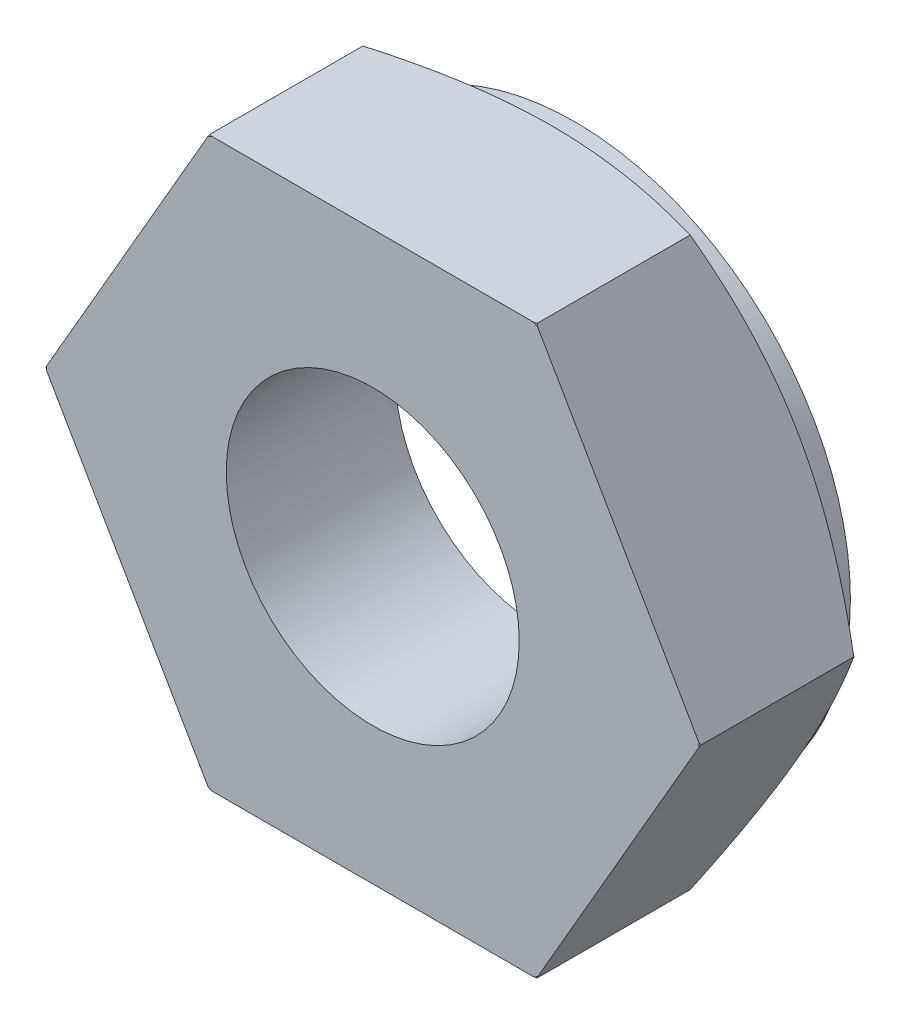
ISO-10303-21;
HEADER;
FILE_DESCRIPTION(('STEP AP214'),'2;1');
FILE_NAME('part.step','',(''),(''),'','','');
FILE_SCHEMA(('AUTOMOTIVE_DESIGN { 1 0 10303 214 1 1 1 1 }'));
ENDSEC;
DATA;
#1=APPLICATION_CONTEXT('core data for automotive mechanical design processes');
#2=APPLICATION_PROTOCOL_DEFINITION('international standard','automotive_design',2000,#1);
#3=PRODUCT_CONTEXT('',#1,'mechanical');
#4=PRODUCT('Part','Part','',(#3));
#5=PRODUCT_RELATED_PRODUCT_CATEGORY('part','',(#4));
#6=PRODUCT_DEFINITION_FORMATION('','',#4);
#7=PRODUCT_DEFINITION_CONTEXT('part definition',#1,'design');
#8=PRODUCT_DEFINITION('design','',#6,#7);
#9=PRODUCT_DEFINITION_SHAPE('','',#8);
#10=(LENGTH_UNIT() NAMED_UNIT(*) SI_UNIT(.MILLI.,.METRE.));
#11=(NAMED_UNIT(*) PLANE_ANGLE_UNIT() SI_UNIT($,.RADIAN.));
#12=(NAMED_UNIT(*) SI_UNIT($,.STERADIAN.) SOLID_ANGLE_UNIT());
#13=UNCERTAINTY_MEASURE_WITH_UNIT(LENGTH_MEASURE(1.E-05),#10,'distance_accuracy_value','');
#14=(GEOMETRIC_REPRESENTATION_CONTEXT(3) GLOBAL_UNCERTAINTY_ASSIGNED_CONTEXT((#13)) GLOBAL_UNIT_ASSIGNED_CONTEXT((#10,
#11,#12)) REPRESENTATION_CONTEXT('',''));
#15=CARTESIAN_POINT('',(0.,0.,0.));
#16=DIRECTION('',(0.,0.,1.));
#17=DIRECTION('',(1.,0.,0.));
#18=AXIS2_PLACEMENT_3D('',#15,#16,#17);
#19=CARTESIAN_POINT('',(-2.6816006012953E-11,-4.74646363879394E-11,-0.680581742286772));
#20=DIRECTION('',(-1.21764595771653E-12,-2.10902466439644E-12,-1.));
#21=DIRECTION('',(0.,1.,-2.10902466439644E-12));
#22=AXIS2_PLACEMENT_3D('',#19,#20,#21);
#23=CONICAL_SURFACE('',#22,4.61880215640778,1.04719755119857);
#24=CARTESIAN_POINT('',(2.30940107875971,3.99999999902235,-0.680581740749376));
#25=CARTESIAN_POINT('',(2.31109554353423,3.99706509745271,-0.679603439812127));
#26=CARTESIAN_POINT('',(2.31279022452801,3.9941298238691,-0.67862663034165));
#27=CARTESIAN_POINT('',(2.31448512075489,3.99119417749059,-0.677651318233623));
#28=CARTESIAN_POINT('',(2.31618001698312,3.98825853110974,-0.676676006124824));
#29=CARTESIAN_POINT('',(2.31787512877524,3.98532251136127,-0.675702191188233));
#30=CARTESIAN_POINT('',(2.31957045600892,3.98238611845708,-0.674729880080408));
#31=CARTESIAN_POINT('',(2.32232641612284,3.97761265551613,-0.673149270403256));
#32=CARTESIAN_POINT('',(2.32508294673428,3.97283820444429,-0.671572634140082));
#33=CARTESIAN_POINT('',(2.32784004726795,3.96806276623838,-0.670000000000012));
#34=B_SPLINE_CURVE_WITH_KNOTS('',3,(#24,#25,#26,#27,#28,#29,#30,#31,#32,#33),.UNSPECIFIED.,.F.,
.F.,(4,3,3,4),(5.99577445606557E-13,1.05819345721559E-05,2.11638691582679E-05,
3.8366090546807E-05),.UNSPECIFIED.);
#35=CARTESIAN_POINT('',(2.30940107875971,3.99999999902235,-0.680581740749376));
#36=VERTEX_POINT('',#35);
#37=CARTESIAN_POINT('',(2.32784004726795,3.96806276623838,-0.670000000000012));
#38=VERTEX_POINT('',#37);
#39=EDGE_CURVE('E188',#36,#38,#34,.T.);
#40=ORIENTED_EDGE('',*,*,#39,.F.);
#41=CARTESIAN_POINT('',(2.27252313573961,4.,-0.670000000000011));
#42=CARTESIAN_POINT('',(2.27591519326911,4.,-0.670967404962364));
#43=CARTESIAN_POINT('',(2.27930681926403,4.00000000000012,-0.671936324305918));
#44=CARTESIAN_POINT('',(2.28269801345091,4.00000000000012,-0.672906751341546));
#45=CARTESIAN_POINT('',(2.28608920763507,4.00000000000012,-0.673877178376397));
#46=CARTESIAN_POINT('',(2.2894799706816,4.00000000000012,-0.674849113295178));
#47=CARTESIAN_POINT('',(2.29287030233476,4.00000000000012,-0.675822549428773));
#48=CARTESIAN_POINT('',(2.2983816994902,4.00000000000012,-0.67740498846027));
#49=CARTESIAN_POINT('',(2.30389195892164,4.00000000000084,-0.678991395326178));
#50=CARTESIAN_POINT('',(2.30940107875971,3.99999999902235,-0.680581740749376));
#51=B_SPLINE_CURVE_WITH_KNOTS('',3,(#41,#42,#43,#44,#45,#46,#47,#48,#49,#50),.UNSPECIFIED.,.F.,
.F.,(4,3,3,4),(0.,1.05819345963508E-05,2.11638691785809E-05,3.83660947732435E-05),.UNSPECIFIED.);
#52=CARTESIAN_POINT('',(2.27252313573961,4.,-0.670000000000011));
#53=VERTEX_POINT('',#52);
#54=EDGE_CURVE('E178',#53,#36,#51,.T.);
#55=ORIENTED_EDGE('',*,*,#54,.F.);
#56=CARTESIAN_POINT('',(6.78146774846233E-12,1.10818472454088E-11,-0.670000000002261));
#57=DIRECTION('',(-2.29799528668942E-13,-4.3197236404671E-13,1.));
#58=DIRECTION('',(0.506000039667893,0.862533454340231,4.88877660549044E-13));
#59=AXIS2_PLACEMENT_3D('',#56,#57,#58);
#60=CIRCLE('',#59,4.60047404104754);
#61=EDGE_CURVE('E144',#38,#53,#60,.T.);
#62=ORIENTED_EDGE('',*,*,#61,.F.);
#63=EDGE_LOOP('',(#40,#55,#62));
#64=FACE_BOUND('',#63,.T.);
#65=ADVANCED_FACE('F17',(#64),#23,.T.);
#66=CARTESIAN_POINT('',(6.49675625796764E-12,-1.04811992418519E-11,-0.680581742289507));
#67=DIRECTION('',(9.74116766164277E-13,-1.68721973150091E-12,-1.));
#68=DIRECTION('',(0.,1.,-1.68721973150091E-12));
#69=AXIS2_PLACEMENT_3D('',#66,#67,#68);
#70=CONICAL_SURFACE('',#69,4.61880215636643,1.04719755119799);
#71=CARTESIAN_POINT('',(-2.30940107491067,4.00000000124463,-0.6805817407494));
#72=CARTESIAN_POINT('',(-2.30601214320622,4.,-0.679603439811884));
#73=CARTESIAN_POINT('',(-2.30262278121873,4.00000000000012,-0.678626630341363));
#74=CARTESIAN_POINT('',(-2.29923298876479,4.00000000000012,-0.677651318233292));
#75=CARTESIAN_POINT('',(-2.29584319630818,4.00000000000012,-0.676676006124449));
#76=CARTESIAN_POINT('',(-2.29245297272378,4.00000000000012,-0.675702191187815));
#77=CARTESIAN_POINT('',(-2.28906231825627,4.00000000000012,-0.674729880079946));
#78=CARTESIAN_POINT('',(-2.28355039802894,4.00000000000012,-0.673149270402948));
#79=CARTESIAN_POINT('',(-2.27803733680642,4.,-0.671572634139929));
#80=CARTESIAN_POINT('',(-2.2725231357396,4.,-0.670000000000011));
#81=B_SPLINE_CURVE_WITH_KNOTS('',3,(#71,#72,#73,#74,#75,#76,#77,#78,#79,#80),.UNSPECIFIED.,.F.,
.F.,(4,3,3,4),(5.99757053684347E-13,1.05819345726432E-05,2.11638691592435E-05,
3.83660905461181E-05),.UNSPECIFIED.);
#82=CARTESIAN_POINT('',(-2.30940107491067,4.00000000124463,-0.6805817407494));
#83=VERTEX_POINT('',#82);
#84=CARTESIAN_POINT('',(-2.2725231357396,4.,-0.670000000000011));
#85=VERTEX_POINT('',#84);
#86=EDGE_CURVE('E105',#83,#85,#81,.T.);
#87=ORIENTED_EDGE('',*,*,#86,.F.);
#88=CARTESIAN_POINT('',(-2.32784004726795,3.96806276623838,-0.670000000000011));
#89=CARTESIAN_POINT('',(-2.32614401850312,3.97100037423016,-0.67096740496241));
#90=CARTESIAN_POINT('',(-2.32444820550568,3.9739376085021,-0.671936324306007));
#91=CARTESIAN_POINT('',(-2.32275260841217,3.97687446881724,-0.672906751341681));
#92=CARTESIAN_POINT('',(-2.32105701132001,3.97981132913003,-0.673877178376577));
#93=CARTESIAN_POINT('',(-2.31936162979667,3.98274781606667,-0.674849113295404));
#94=CARTESIAN_POINT('',(-2.31766646397,3.9856839294057,-0.675822549429045));
#95=CARTESIAN_POINT('',(-2.3149107653923,3.99045693935262,-0.677404988460534));
#96=CARTESIAN_POINT('',(-2.31215563567721,3.99522896400202,-0.678991395326433));
#97=CARTESIAN_POINT('',(-2.30940107491067,4.00000000124463,-0.6805817407494));
#98=B_SPLINE_CURVE_WITH_KNOTS('',3,(#88,#89,#90,#91,#92,#93,#94,#95,#96,#97),.UNSPECIFIED.,.F.,
.F.,(4,3,3,4),(0.,1.05819345968407E-05,2.11638691795613E-05,3.83660947738123E-05),.UNSPECIFIED.);
#99=CARTESIAN_POINT('',(-2.32784004726795,3.96806276623838,-0.670000000000011));
#100=VERTEX_POINT('',#99);
#101=EDGE_CURVE('E100',#100,#83,#98,.T.);
#102=ORIENTED_EDGE('',*,*,#101,.F.);
#103=CARTESIAN_POINT('',(2.86682570044272E-11,-5.12975079081102E-11,-0.669999999991013));
#104=DIRECTION('',(-9.77997610678283E-13,1.69394155137646E-12,1.));
#105=DIRECTION('',(-0.493975863238513,0.869475615838516,-1.95595841865769E-12));
#106=AXIS2_PLACEMENT_3D('',#103,#104,#105);
#107=CIRCLE('',#106,4.60047404111929);
#108=EDGE_CURVE('E151',#85,#100,#107,.T.);
#109=ORIENTED_EDGE('',*,*,#108,.F.);
#110=EDGE_LOOP('',(#87,#102,#109));
#111=FACE_BOUND('',#110,.T.);
#112=ADVANCED_FACE('F360',(#111),#70,.T.);
#113=CARTESIAN_POINT('',(-1.0385399137891E-10,-2.43403387722996E-13,-0.680581740659381));
#114=DIRECTION('',(4.87058383373105E-13,0.,-1.));
#115=DIRECTION('',(-1.,0.,-4.87058383373105E-13));
#116=AXIS2_PLACEMENT_3D('',#113,#114,#115);
#117=CONICAL_SURFACE('',#116,4.61880215341511,1.04719755119674);
#118=CARTESIAN_POINT('',(-4.61880215351715,-5.5768441702576E-13,-0.680581740660485));
#119=CARTESIAN_POINT('',(-4.61710768813273,0.00293490013723975,-0.679603440614757));
#120=CARTESIAN_POINT('',(-4.61541300740135,0.0058701732668162,-0.678626631294442));
#121=CARTESIAN_POINT('',(-4.61371811143673,0.00880581919108245,-0.677651319336112));
#122=CARTESIAN_POINT('',(-4.61202321547077,0.0117414651176712,-0.67667600737701));
#123=CARTESIAN_POINT('',(-4.61032810394098,0.0146774844117687,-0.67570219258965));
#124=CARTESIAN_POINT('',(-4.6086327769697,0.0176138768614659,-0.674729881630588));
#125=CARTESIAN_POINT('',(-4.60587681595523,0.0223873413622129,-0.673149271434139));
#126=CARTESIAN_POINT('',(-4.60312028444266,0.0271617939943756,-0.671572634654254));
#127=CARTESIAN_POINT('',(-4.60036318300763,0.0319372337613647,-0.670000000000051));
#128=B_SPLINE_CURVE_WITH_KNOTS('',3,(#118,#119,#120,#121,#122,#123,#124,#125,#126,#127),
.UNSPECIFIED.,.F.,.F.,(4,3,3,4),(0.,1.05819329357515E-05,2.11638658854599E-05,
3.83660928974069E-05),.UNSPECIFIED.);
#129=CARTESIAN_POINT('',(-4.61880215351715,-5.5768441702576E-13,-0.680581740660485));
#130=VERTEX_POINT('',#129);
#131=CARTESIAN_POINT('',(-4.60036318300763,0.0319372337613647,-0.670000000000051));
#132=VERTEX_POINT('',#131);
#133=EDGE_CURVE('E180',#130,#132,#128,.T.);
#134=ORIENTED_EDGE('',*,*,#133,.F.);
#135=CARTESIAN_POINT('',(-4.60036318300756,-0.031937233761607,-0.670000000000011));
#136=CARTESIAN_POINT('',(-4.60205921151004,-0.028999626224242,-0.670967404812763));
#137=CARTESIAN_POINT('',(-4.60375502424539,-0.0260623924067227,-0.671936324006244));
#138=CARTESIAN_POINT('',(-4.60545062107668,-0.0231255325457661,-0.672906750891337));
#139=CARTESIAN_POINT('',(-4.60714621790662,-0.0201886726871613,-0.673877177775652));
#140=CARTESIAN_POINT('',(-4.6088415991678,-0.0172521862045915,-0.674849112543432));
#141=CARTESIAN_POINT('',(-4.61053676473238,-0.0143160733195081,-0.675822548525564));
#142=CARTESIAN_POINT('',(-4.61329246335562,-0.00954306329370263,-0.677404987581569));
#143=CARTESIAN_POINT('',(-4.61604759311746,-0.00477103856617081,-0.678991394472121));
#144=CARTESIAN_POINT('',(-4.61880215351715,-5.5768441702576E-13,-0.680581740660485));
#145=B_SPLINE_CURVE_WITH_KNOTS('',3,(#135,#136,#137,#138,#139,#140,#141,#142,#143,#144),
.UNSPECIFIED.,.F.,.F.,(4,3,3,4),(0.,1.05819329602815E-05,2.11638659064435E-05,
3.83660928251446E-05),.UNSPECIFIED.);
#146=CARTESIAN_POINT('',(-4.60036318300756,-0.031937233761607,-0.670000000000011));
#147=VERTEX_POINT('',#146);
#148=EDGE_CURVE('E182',#147,#130,#145,.T.);
#149=ORIENTED_EDGE('',*,*,#148,.F.);
#150=CARTESIAN_POINT('',(6.3565082017436E-10,4.75498885600147E-12,-0.670000000448821));
#151=DIRECTION('',(9.75552616786171E-11,6.26338844344908E-13,1.));
#152=DIRECTION('',(-0.999975902906545,0.00694216149621711,9.75485565489689E-11));
#153=AXIS2_PLACEMENT_3D('',#150,#151,#152);
#154=CIRCLE('',#153,4.6004740416962);
#155=EDGE_CURVE('E156',#132,#147,#154,.T.);
#156=ORIENTED_EDGE('',*,*,#155,.F.);
#157=EDGE_LOOP('',(#134,#149,#156));
#158=FACE_BOUND('',#157,.T.);
#159=ADVANCED_FACE('F363',(#158),#117,.T.);
#160=CARTESIAN_POINT('',(3.39034356144907E-11,5.82919129632486E-11,-0.680581742289119));
#161=DIRECTION('',(9.74116766176773E-13,1.68721973152269E-12,-1.));
#162=DIRECTION('',(0.,1.,1.68721973152269E-12));
#163=AXIS2_PLACEMENT_3D('',#160,#161,#162);
#164=CONICAL_SURFACE('',#163,4.61880215642087,1.04719755119822);
#165=CARTESIAN_POINT('',(-2.30940107875983,-3.99999999902228,-0.680581740749377));
#166=CARTESIAN_POINT('',(-2.31109554353431,-3.99706509745256,-0.679603439812072));
#167=CARTESIAN_POINT('',(-2.31279022452809,-3.99412982386893,-0.678626630341587));
#168=CARTESIAN_POINT('',(-2.314485120755,-3.99119417749037,-0.677651318233551));
#169=CARTESIAN_POINT('',(-2.31618001698324,-3.9882585311095,-0.676676006124744));
#170=CARTESIAN_POINT('',(-2.31787512877538,-3.98532251136101,-0.675702191188145));
#171=CARTESIAN_POINT('',(-2.31957045600908,-3.9823861184568,-0.674729880080312));
#172=CARTESIAN_POINT('',(-2.32232641612295,-3.97761265551594,-0.673149270403193));
#173=CARTESIAN_POINT('',(-2.32508294673432,-3.97283820444419,-0.671572634140053));
#174=CARTESIAN_POINT('',(-2.32784004726794,-3.96806276623838,-0.670000000000013));
#175=B_SPLINE_CURVE_WITH_KNOTS('',3,(#165,#166,#167,#168,#169,#170,#171,#172,#173,#174),
.UNSPECIFIED.,.F.,.F.,(4,3,3,4),(5.99614133026729E-13,1.05819345722576E-05,2.11638691584699E-05,
3.83660905466504E-05),.UNSPECIFIED.);
#176=CARTESIAN_POINT('',(-2.30940107875983,-3.99999999902228,-0.680581740749377));
#177=VERTEX_POINT('',#176);
#178=CARTESIAN_POINT('',(-2.32784004726794,-3.96806276623838,-0.670000000000013));
#179=VERTEX_POINT('',#178);
#180=EDGE_CURVE('E175',#177,#179,#175,.T.);
#181=ORIENTED_EDGE('',*,*,#180,.F.);
#182=CARTESIAN_POINT('',(-2.27252313573961,-4.,-0.67000000000001));
#183=CARTESIAN_POINT('',(-2.27591519326914,-4.,-0.670967404962372));
#184=CARTESIAN_POINT('',(-2.27930681926409,-4.00000000000012,-0.671936324305935));
#185=CARTESIAN_POINT('',(-2.28269801345101,-4.00000000000012,-0.672906751341572));
#186=CARTESIAN_POINT('',(-2.28608920763521,-4.00000000000012,-0.673877178376432));
#187=CARTESIAN_POINT('',(-2.28947997068176,-4.00000000000012,-0.674849113295222));
#188=CARTESIAN_POINT('',(-2.29287030233496,-4.00000000000012,-0.675822549428827));
#189=CARTESIAN_POINT('',(-2.29838169949039,-4.00000000000012,-0.677404988460322));
#190=CARTESIAN_POINT('',(-2.30389195892182,-4.00000000000084,-0.678991395326227));
#191=CARTESIAN_POINT('',(-2.30940107875983,-3.99999999902228,-0.680581740749377));
#192=B_SPLINE_CURVE_WITH_KNOTS('',3,(#182,#183,#184,#185,#186,#187,#188,#189,#190,#191),
.UNSPECIFIED.,.F.,.F.,(4,3,3,4),(0.,1.05819345964501E-05,2.1163869178782E-05,
3.83660947733558E-05),.UNSPECIFIED.);
#193=CARTESIAN_POINT('',(-2.27252313573961,-4.,-0.67000000000001));
#194=VERTEX_POINT('',#193);
#195=EDGE_CURVE('E203',#194,#177,#192,.T.);
#196=ORIENTED_EDGE('',*,*,#195,.F.);
#197=CARTESIAN_POINT('',(2.80472260000275E-11,4.87851946340268E-11,-0.670000000022507));
#198=DIRECTION('',(2.40383437950503E-12,4.2586174118264E-12,1.));
#199=DIRECTION('',(-0.506000039667843,-0.86253345434026,4.88953075529813E-12));
#200=AXIS2_PLACEMENT_3D('',#197,#198,#199);
#201=CIRCLE('',#200,4.6004740411168);
#202=EDGE_CURVE('E161',#179,#194,#201,.T.);
#203=ORIENTED_EDGE('',*,*,#202,.F.);
#204=EDGE_LOOP('',(#181,#196,#203));
#205=FACE_BOUND('',#204,.T.);
#206=ADVANCED_FACE('F364',(#205),#164,.T.);
#207=CARTESIAN_POINT('',(5.30764668327244E-11,-9.19195275450591E-11,-0.680581742289535));
#208=DIRECTION('',(-9.74116766138901E-13,1.68721973145726E-12,-1.));
#209=DIRECTION('',(0.,1.,1.68721973145726E-12));
#210=AXIS2_PLACEMENT_3D('',#207,#208,#209);
#211=CONICAL_SURFACE('',#210,4.61880215624801,1.0471975511982);
#212=CARTESIAN_POINT('',(2.30940107491066,-4.00000000124465,-0.680581740749403));
#213=CARTESIAN_POINT('',(2.30601214320619,-4.,-0.679603439811875));
#214=CARTESIAN_POINT('',(2.30262278121869,-4.00000000000012,-0.67862663034135));
#215=CARTESIAN_POINT('',(2.29923298876475,-4.00000000000012,-0.677651318233277));
#216=CARTESIAN_POINT('',(2.29584319630813,-4.00000000000012,-0.676676006124431));
#217=CARTESIAN_POINT('',(2.29245297272371,-4.00000000000012,-0.675702191187794));
#218=CARTESIAN_POINT('',(2.28906231825619,-4.00000000000012,-0.674729880079922));
#219=CARTESIAN_POINT('',(2.2835503980289,-4.00000000000012,-0.673149270402932));
#220=CARTESIAN_POINT('',(2.2780373368064,-4.,-0.671572634139921));
#221=CARTESIAN_POINT('',(2.27252313573961,-4.,-0.670000000000011));
#222=B_SPLINE_CURVE_WITH_KNOTS('',3,(#212,#213,#214,#215,#216,#217,#218,#219,#220,#221),
.UNSPECIFIED.,.F.,.F.,(4,3,3,4),(5.99763368156488E-13,1.05819345726731E-05,2.11638691593029E-05,
3.83660905460864E-05),.UNSPECIFIED.);
#223=CARTESIAN_POINT('',(2.30940107491066,-4.00000000124465,-0.680581740749403));
#224=VERTEX_POINT('',#223);
#225=CARTESIAN_POINT('',(2.27252313573961,-4.,-0.670000000000011));
#226=VERTEX_POINT('',#225);
#227=EDGE_CURVE('E183',#224,#226,#222,.T.);
#228=ORIENTED_EDGE('',*,*,#227,.F.);
#229=CARTESIAN_POINT('',(2.32784004726797,-3.96806276623836,-0.67000000000001));
#230=CARTESIAN_POINT('',(2.32614401850314,-3.97100037423015,-0.670967404962411));
#231=CARTESIAN_POINT('',(2.32444820550569,-3.97393760850209,-0.67193632430601));
#232=CARTESIAN_POINT('',(2.32275260841217,-3.97687446881724,-0.672906751341686));
#233=CARTESIAN_POINT('',(2.32105701132001,-3.97981132913004,-0.673877178376584));
#234=CARTESIAN_POINT('',(2.31936162979667,-3.98274781606668,-0.674849113295413));
#235=CARTESIAN_POINT('',(2.31766646396999,-3.98568392940573,-0.675822549429056));
#236=CARTESIAN_POINT('',(2.31491076539229,-3.99045693935265,-0.677404988460546));
#237=CARTESIAN_POINT('',(2.3121556356772,-3.99522896400206,-0.678991395326446));
#238=CARTESIAN_POINT('',(2.30940107491066,-4.00000000124465,-0.680581740749403));
#239=B_SPLINE_CURVE_WITH_KNOTS('',3,(#229,#230,#231,#232,#233,#234,#235,#236,#237,#238),
.UNSPECIFIED.,.F.,.F.,(4,3,3,4),(0.,1.05819345968679E-05,2.11638691796191E-05,
3.83660947738648E-05),.UNSPECIFIED.);
#240=CARTESIAN_POINT('',(2.32784004726797,-3.96806276623836,-0.67000000000001));
#241=VERTEX_POINT('',#240);
#242=EDGE_CURVE('E11',#241,#224,#239,.T.);
#243=ORIENTED_EDGE('',*,*,#242,.F.);
#244=CARTESIAN_POINT('',(4.69025859817229E-13,-1.17354043149831E-12,-0.670000000001135));
#245=DIRECTION('',(-1.35479587930313E-13,2.04104415330805E-13,1.));
#246=DIRECTION('',(0.493975863238625,-0.869475615838452,2.44391695906318E-13));
#247=AXIS2_PLACEMENT_3D('',#244,#245,#246);
#248=CIRCLE('',#247,4.60047404105928);
#249=EDGE_CURVE('E167',#226,#241,#248,.T.);
#250=ORIENTED_EDGE('',*,*,#249,.F.);
#251=EDGE_LOOP('',(#228,#243,#250));
#252=FACE_BOUND('',#251,.T.);
#253=ADVANCED_FACE('F366',(#252),#211,.T.);
#254=CARTESIAN_POINT('',(6.09664228823359E-11,0.,-0.680581740659519));
#255=DIRECTION('',(-4.87058383373105E-13,0.,-1.));
#256=DIRECTION('',(-1.,0.,4.87058383373105E-13));
#257=AXIS2_PLACEMENT_3D('',#254,#255,#256);
#258=CONICAL_SURFACE('',#257,4.61880215345823,1.04719755119675);
#259=CARTESIAN_POINT('',(4.61880215351829,-1.57707149380836E-12,-0.680581740661246));
#260=CARTESIAN_POINT('',(4.61710768813268,-0.00293490013735579,-0.679603440614728));
#261=CARTESIAN_POINT('',(4.61541300740128,-0.00587017326696992,-0.678626631294399));
#262=CARTESIAN_POINT('',(4.61371811143664,-0.00880581919127437,-0.677651319336057));
#263=CARTESIAN_POINT('',(4.61202321547066,-0.0117414651179017,-0.676676007376942));
#264=CARTESIAN_POINT('',(4.61032810394084,-0.0146774844120383,-0.67570219258957));
#265=CARTESIAN_POINT('',(4.60863277696954,-0.017613876861774,-0.674729881630495));
#266=CARTESIAN_POINT('',(4.60587681592426,-0.0223873414158798,-0.673149271416377));
#267=CARTESIAN_POINT('',(4.60312028438087,-0.0271617941014537,-0.671572634619006));
#268=CARTESIAN_POINT('',(4.60036318296072,-0.0319372339286788,-0.669999999973637));
#269=B_SPLINE_CURVE_WITH_KNOTS('',3,(#259,#260,#261,#262,#263,#264,#265,#266,#267,#268),
.UNSPECIFIED.,.F.,.F.,(4,3,3,4),(0.,1.05819329358771E-05,2.11638658857123E-05,
3.83660930664501E-05),.UNSPECIFIED.);
#270=CARTESIAN_POINT('',(4.61880215351829,-1.57707149380836E-12,-0.680581740661246));
#271=VERTEX_POINT('',#270);
#272=CARTESIAN_POINT('',(4.60036318296072,-0.0319372339286788,-0.669999999973637));
#273=VERTEX_POINT('',#272);
#274=EDGE_CURVE('E35',#271,#273,#269,.T.);
#275=ORIENTED_EDGE('',*,*,#274,.F.);
#276=CARTESIAN_POINT('',(4.60036318302758,0.0319372337269464,-0.67000000001143));
#277=CARTESIAN_POINT('',(4.60205921155009,0.0289996261548701,-0.670967404835639));
#278=CARTESIAN_POINT('',(4.60375502428547,0.0260623923373213,-0.671936324029158));
#279=CARTESIAN_POINT('',(4.60545062111678,0.0231255324763324,-0.672906750914287));
#280=CARTESIAN_POINT('',(4.60714621794674,0.0201886726176954,-0.673877177798639));
#281=CARTESIAN_POINT('',(4.60884159920794,0.017252186135093,-0.674849112566455));
#282=CARTESIAN_POINT('',(4.61053676477253,0.0143160732499772,-0.675822548548623));
#283=CARTESIAN_POINT('',(4.61329246338258,0.00954306324703266,-0.677404987597091));
#284=CARTESIAN_POINT('',(4.61604759313123,0.00477103854235144,-0.678991394480066));
#285=CARTESIAN_POINT('',(4.61880215351829,-1.57707149380836E-12,-0.680581740661246));
#286=B_SPLINE_CURVE_WITH_KNOTS('',3,(#276,#277,#278,#279,#280,#281,#282,#283,#284,#285),
.UNSPECIFIED.,.F.,.F.,(4,3,3,4),(0.,1.05819329607919E-05,2.11638659074643E-05,
3.83660927444136E-05),.UNSPECIFIED.);
#287=CARTESIAN_POINT('',(4.60036318302758,0.0319372337269464,-0.67000000001143));
#288=VERTEX_POINT('',#287);
#289=EDGE_CURVE('E190',#288,#271,#286,.T.);
#290=ORIENTED_EDGE('',*,*,#289,.F.);
#291=CARTESIAN_POINT('',(2.59207876950746E-07,4.61340163729969E-09,-0.669999844856437));
#292=DIRECTION('',(3.37225778036349E-08,5.91676299477891E-10,0.999999999999999));
#293=DIRECTION('',(0.999975902896601,-0.00694216292854743,-3.37176576746832E-08));
#294=AXIS2_PLACEMENT_3D('',#291,#292,#293);
#295=CIRCLE('',#294,4.60047378184595);
#296=EDGE_CURVE('E148',#273,#288,#295,.T.);
#297=ORIENTED_EDGE('',*,*,#296,.F.);
#298=EDGE_LOOP('',(#275,#290,#297));
#299=FACE_BOUND('',#298,.T.);
#300=ADVANCED_FACE('F19',(#299),#258,.T.);
#301=CARTESIAN_POINT('',(2.30890107392137,-4.00086603031786,-3.50708492601135));
#302=DIRECTION('',(0.866025403784438,-0.5,0.));
#303=DIRECTION('',(0.,0.,-1.));
#304=AXIS2_PLACEMENT_3D('',#301,#302,#303);
#305=PLANE('',#304);
#306=DIRECTION('',(0.,0.,-1.));
#307=VECTOR('',#306,1.);
#308=CARTESIAN_POINT('',(4.61880215351701,0.,-2.08804246300569));
#309=LINE('',#308,#307);
#310=CARTESIAN_POINT('',(4.61880215351696,0.,-2.83941825934397));
#311=VERTEX_POINT('',#310);
#312=EDGE_CURVE('E103',#271,#311,#309,.T.);
#313=ORIENTED_EDGE('',*,*,#312,.F.);
#314=ORIENTED_EDGE('',*,*,#274,.T.);
#315=DIRECTION('',(0.5,0.866025403784439,0.));
#316=VECTOR('',#315,1.);
#317=CARTESIAN_POINT('',(2.32784004726797,-3.96806276623836,-0.67000000000001));
#318=LINE('',#317,#316);
#319=EDGE_CURVE('E170',#241,#273,#318,.T.);
#320=ORIENTED_EDGE('',*,*,#319,.F.);
#321=ORIENTED_EDGE('',*,*,#242,.T.);
#322=DIRECTION('',(0.,0.,1.));
#323=VECTOR('',#322,1.);
#324=CARTESIAN_POINT('',(2.30940107675852,-4.,-2.08804246300658));
#325=LINE('',#324,#323);
#326=CARTESIAN_POINT('',(2.30940107675908,-4.,-2.83941825934378));
#327=VERTEX_POINT('',#326);
#328=EDGE_CURVE('E177',#327,#224,#325,.T.);
#329=ORIENTED_EDGE('',*,*,#328,.F.);
#330=CARTESIAN_POINT('',(4.61880215351691,-1.88899811223218E-13,-2.839418259344));
#331=CARTESIAN_POINT('',(4.51731796243084,-0.175775775126285,-2.89802716909075));
#332=CARTESIAN_POINT('',(4.41495776125106,-0.353068844242638,-2.95132890514366));
#333=CARTESIAN_POINT('',(4.20846506047872,-0.710724693372443,-3.04436548454365));
#334=CARTESIAN_POINT('',(4.10432889310483,-0.89109382616953,-3.08406741866802));
#335=CARTESIAN_POINT('',(3.89734706567695,-1.24959686751806,-3.14586634145208));
#336=CARTESIAN_POINT('',(3.79453324350908,-1.42767563123317,-3.16837468415045));
#337=CARTESIAN_POINT('',(3.58842207856454,-1.78467064092432,-3.19523992308338));
#338=CARTESIAN_POINT('',(3.48512548443188,-1.96358559021092,-3.19961907139587));
#339=CARTESIAN_POINT('',(3.29212687968653,-2.29786897941975,-3.19048567903467));
#340=CARTESIAN_POINT('',(3.2023959080609,-2.45328758128788,-3.17921568891172));
#341=CARTESIAN_POINT('',(3.02351853282008,-2.76311228352954,-3.14350365790789));
#342=CARTESIAN_POINT('',(2.93437274743219,-2.91751731310198,-3.11904942980685));
#343=CARTESIAN_POINT('',(2.75512686792893,-3.227980283449,-3.05791859266748));
#344=CARTESIAN_POINT('',(2.6650494483543,-3.38399895076696,-3.02098297490751));
#345=CARTESIAN_POINT('',(2.48623772534412,-3.69370994000953,-2.93715473766539));
#346=CARTESIAN_POINT('',(2.39750113289084,-3.84740622662914,-2.89028180183967));
#347=CARTESIAN_POINT('',(2.30940107675873,-3.99999999999963,-2.83941825934407));
#348=B_SPLINE_CURVE_WITH_KNOTS('',3,(#330,#331,#332,#333,#334,#335,#336,#337,#338,#339,#340,
#341,#342,#343,#344,#345,#346,#347),.UNSPECIFIED.,.F.,.F.,(4,2,2,2,2,2,2,2,4),(0.,
0.634032023113784,1.26958763405437,1.88941521230605,2.50848177779589,3.04741556526383,
3.58684838758865,4.13824324497697,4.68855594702936),.UNSPECIFIED.);
#349=EDGE_CURVE('E337',#311,#327,#348,.T.);
#350=ORIENTED_EDGE('',*,*,#349,.F.);
#351=EDGE_LOOP('',(#313,#314,#320,#321,#329,#350));
#352=FACE_BOUND('',#351,.T.);
#353=ADVANCED_FACE('F351',(#352),#305,.T.);
#354=CARTESIAN_POINT('',(-2.31040108243136,-4.,-3.50708492601315));
#355=DIRECTION('',(0.,-1.,0.));
#356=DIRECTION('',(0.,0.,-1.));
#357=AXIS2_PLACEMENT_3D('',#354,#355,#356);
#358=PLANE('',#357);
#359=ORIENTED_EDGE('',*,*,#328,.T.);
#360=ORIENTED_EDGE('',*,*,#227,.T.);
#361=DIRECTION('',(1.,0.,0.));
#362=VECTOR('',#361,1.);
#363=CARTESIAN_POINT('',(-2.27252313573961,-4.,-0.67000000000001));
#364=LINE('',#363,#362);
#365=EDGE_CURVE('E165',#194,#226,#364,.T.);
#366=ORIENTED_EDGE('',*,*,#365,.F.);
#367=ORIENTED_EDGE('',*,*,#195,.T.);
#368=DIRECTION('',(0.,0.,1.));
#369=VECTOR('',#368,1.);
#370=CARTESIAN_POINT('',(-2.30940107675849,-4.,-2.08804246300499));
#371=LINE('',#370,#369);
#372=CARTESIAN_POINT('',(-2.30940107675821,-4.00000000000049,-2.83941825934379));
#373=VERTEX_POINT('',#372);
#374=EDGE_CURVE('E171',#373,#177,#371,.T.);
#375=ORIENTED_EDGE('',*,*,#374,.F.);
#376=CARTESIAN_POINT('',(2.30940107675964,-4.,-2.83941825934362));
#377=CARTESIAN_POINT('',(2.10643269458749,-4.,-2.8980271690904));
#378=CARTESIAN_POINT('',(1.9017122922279,-4.,-2.95132890514334));
#379=CARTESIAN_POINT('',(1.48872689068318,-4.,-3.0443654845434));
#380=CARTESIAN_POINT('',(1.28045455593536,-4.,-3.08406741866781));
#381=CARTESIAN_POINT('',(0.866490901079567,-4.,-3.14586634145194));
#382=CARTESIAN_POINT('',(0.660863256743795,-4.,-3.16837468415034));
#383=CARTESIAN_POINT('',(0.248640926854664,-4.,-3.19523992308335));
#384=CARTESIAN_POINT('',(0.042047738589309,-4.,-3.19961907139587));
#385=CARTESIAN_POINT('',(-0.34394947090149,-4.,-3.19048567903472));
#386=CARTESIAN_POINT('',(-0.523411414152852,-4.,-3.17921568891179));
#387=CARTESIAN_POINT('',(-0.881166164634661,-4.,-3.14350365790798));
#388=CARTESIAN_POINT('',(-1.05945773541052,-4.,-3.11904942980695));
#389=CARTESIAN_POINT('',(-1.41794949441721,-4.,-3.05791859266757));
#390=CARTESIAN_POINT('',(-1.59810433356657,-4.,-3.0209829749076));
#391=CARTESIAN_POINT('',(-1.95572777958711,-4.,-2.93715473766544));
#392=CARTESIAN_POINT('',(-2.13320096449376,-4.,-2.8902818018397));
#393=CARTESIAN_POINT('',(-2.30940107675807,-4.,-2.83941825934407));
#394=B_SPLINE_CURVE_WITH_KNOTS('',3,(#376,#377,#378,#379,#380,#381,#382,#383,#384,#385,#386,
#387,#388,#389,#390,#391,#392,#393),.UNSPECIFIED.,.F.,.F.,(4,2,2,2,2,2,2,2,4),(0.,
0.634032023113874,1.26958763405455,1.88941521230631,2.50848177779624,3.04741556526444,
3.58684838758951,4.1382432449781,4.68855594703076),.UNSPECIFIED.);
#395=EDGE_CURVE('E304',#327,#373,#394,.T.);
#396=ORIENTED_EDGE('',*,*,#395,.F.);
#397=EDGE_LOOP('',(#359,#360,#366,#367,#375,#396));
#398=FACE_BOUND('',#397,.T.);
#399=ADVANCED_FACE('F317',(#398),#358,.T.);
#400=CARTESIAN_POINT('',(-4.61930215351895,0.000866025407173966,-3.50708492600997));
#401=DIRECTION('',(-0.86602540378444,-0.5,0.));
#402=DIRECTION('',(-0.5,0.86602540378444,0.));
#403=AXIS2_PLACEMENT_3D('',#400,#401,#402);
#404=PLANE('',#403);
#405=ORIENTED_EDGE('',*,*,#374,.T.);
#406=ORIENTED_EDGE('',*,*,#180,.T.);
#407=DIRECTION('',(0.5,-0.866025403784439,0.));
#408=VECTOR('',#407,1.);
#409=CARTESIAN_POINT('',(-4.60036318300756,-0.0319372337616078,-0.670000000000011));
#410=LINE('',#409,#408);
#411=EDGE_CURVE('E160',#147,#179,#410,.T.);
#412=ORIENTED_EDGE('',*,*,#411,.F.);
#413=ORIENTED_EDGE('',*,*,#148,.T.);
#414=DIRECTION('',(0.,0.,1.));
#415=VECTOR('',#414,1.);
#416=CARTESIAN_POINT('',(-4.618802153517,0.,-2.08804246300499));
#417=LINE('',#416,#415);
#418=CARTESIAN_POINT('',(-4.61880215351676,0.,-2.83941825934409));
#419=VERTEX_POINT('',#418);
#420=EDGE_CURVE('E78',#419,#130,#417,.T.);
#421=ORIENTED_EDGE('',*,*,#420,.F.);
#422=CARTESIAN_POINT('',(-2.30940107675793,-4.00000000000098,-2.83941825934362));
#423=CARTESIAN_POINT('',(-2.41088526784401,-3.82422422487486,-2.8980271690904));
#424=CARTESIAN_POINT('',(-2.5132454690238,-3.64693115575849,-2.95132890514335));
#425=CARTESIAN_POINT('',(-2.71973816979616,-3.28927530662865,-3.0443654845434));
#426=CARTESIAN_POINT('',(-2.82387433717007,-3.10890617383154,-3.08406741866782));
#427=CARTESIAN_POINT('',(-3.03085616459796,-2.75040313248297,-3.14586634145194));
#428=CARTESIAN_POINT('',(-3.13366998676585,-2.57232436876784,-3.16837468415035));
#429=CARTESIAN_POINT('',(-3.33978115171041,-2.21532935907664,-3.19523992308335));
#430=CARTESIAN_POINT('',(-3.44307774584309,-2.03641440979002,-3.19961907139587));
#431=CARTESIAN_POINT('',(-3.63607635058849,-1.70213102058109,-3.19048567903473));
#432=CARTESIAN_POINT('',(-3.72580732221417,-1.54671241871289,-3.1792156889118));
#433=CARTESIAN_POINT('',(-3.90468469745507,-1.23688771647109,-3.14350365790799));
#434=CARTESIAN_POINT('',(-3.993830482843,-1.08248268689856,-3.11904942980696));
#435=CARTESIAN_POINT('',(-4.17307636234634,-0.772019716551404,-3.05791859266758));
#436=CARTESIAN_POINT('',(-4.26315378192102,-0.616001049233365,-3.02098297490761));
#437=CARTESIAN_POINT('',(-4.44196550493129,-0.306290059990643,-2.93715473766546));
#438=CARTESIAN_POINT('',(-4.53070209738461,-0.152593773370958,-2.89028180183971));
#439=CARTESIAN_POINT('',(-4.61880215351676,-4.01254102503013E-13,-2.83941825934409));
#440=B_SPLINE_CURVE_WITH_KNOTS('',3,(#422,#423,#424,#425,#426,#427,#428,#429,#430,#431,#432,
#433,#434,#435,#436,#437,#438,#439),.UNSPECIFIED.,.F.,.F.,(4,2,2,2,2,2,2,2,4),(0.,
0.634032023113873,1.26958763405455,1.88941521230631,2.50848177779624,3.04741556526442,
3.58684838758949,4.13824324497808,4.68855594703072),.UNSPECIFIED.);
#441=EDGE_CURVE('E118',#373,#419,#440,.T.);
#442=ORIENTED_EDGE('',*,*,#441,.F.);
#443=EDGE_LOOP('',(#405,#406,#412,#413,#421,#442));
#444=FACE_BOUND('',#443,.T.);
#445=ADVANCED_FACE('F312',(#444),#404,.T.);
#446=CARTESIAN_POINT('',(-2.3089010739214,4.00086603031779,-3.50708492600997));
#447=DIRECTION('',(-0.866025403784439,0.5,0.));
#448=DIRECTION('',(0.,0.,1.));
#449=AXIS2_PLACEMENT_3D('',#446,#447,#448);
#450=PLANE('',#449);
#451=ORIENTED_EDGE('',*,*,#420,.T.);
#452=ORIENTED_EDGE('',*,*,#133,.T.);
#453=DIRECTION('',(-0.5,-0.866025403784438,0.));
#454=VECTOR('',#453,1.);
#455=CARTESIAN_POINT('',(-2.32784004726794,3.96806276623838,-0.670000000000011));
#456=LINE('',#455,#454);
#457=EDGE_CURVE('E155',#100,#132,#456,.T.);
#458=ORIENTED_EDGE('',*,*,#457,.F.);
#459=ORIENTED_EDGE('',*,*,#101,.T.);
#460=DIRECTION('',(0.,0.,1.));
#461=VECTOR('',#460,1.);
#462=CARTESIAN_POINT('',(-2.3094010767585,4.,-2.08804246300658));
#463=LINE('',#462,#461);
#464=CARTESIAN_POINT('',(-2.30940107675906,4.,-2.83941825934378));
#465=VERTEX_POINT('',#464);
#466=EDGE_CURVE('E89',#465,#83,#463,.T.);
#467=ORIENTED_EDGE('',*,*,#466,.F.);
#468=CARTESIAN_POINT('',(-4.61880215351677,4.15340147357459E-13,-2.83941825934409));
#469=CARTESIAN_POINT('',(-4.5173179624307,0.175775775126507,-2.89802716909082));
#470=CARTESIAN_POINT('',(-4.41495776125092,0.353068844242856,-2.95132890514373));
#471=CARTESIAN_POINT('',(-4.20846506047859,0.710724693372652,-3.0443654845437));
#472=CARTESIAN_POINT('',(-4.10432889310469,0.891093826169734,-3.08406741866807));
#473=CARTESIAN_POINT('',(-3.89734706567683,1.24959686751825,-3.14586634145211));
#474=CARTESIAN_POINT('',(-3.79453324350896,1.42767563123336,-3.16837468415047));
#475=CARTESIAN_POINT('',(-3.58842207856442,1.7846706409245,-3.19523992308339));
#476=CARTESIAN_POINT('',(-3.48512548443176,1.96358559021109,-3.19961907139587));
#477=CARTESIAN_POINT('',(-3.29212687968643,2.29786897941991,-3.19048567903466));
#478=CARTESIAN_POINT('',(-3.2023959080608,2.45328758128802,-3.17921568891171));
#479=CARTESIAN_POINT('',(-3.02351853282,2.76311228352965,-3.14350365790788));
#480=CARTESIAN_POINT('',(-2.93437274743212,2.91751731310209,-3.11904942980684));
#481=CARTESIAN_POINT('',(-2.75512686792888,3.22798028344907,-3.05791859266747));
#482=CARTESIAN_POINT('',(-2.66504944835426,3.38399895076702,-3.0209829749075));
#483=CARTESIAN_POINT('',(-2.48623772534409,3.69370994000956,-2.93715473766539));
#484=CARTESIAN_POINT('',(-2.39750113289082,3.84740622662916,-2.89028180183966));
#485=CARTESIAN_POINT('',(-2.30940107675872,3.99999999999963,-2.83941825934407));
#486=B_SPLINE_CURVE_WITH_KNOTS('',3,(#468,#469,#470,#471,#472,#473,#474,#475,#476,#477,#478,
#479,#480,#481,#482,#483,#484,#485),.UNSPECIFIED.,.F.,.F.,(4,2,2,2,2,2,2,2,4),(0.,
0.634032023113764,1.26958763405433,1.88941521230599,2.50848177779582,3.04741556526371,
3.58684838758848,4.13824324497675,4.68855594702908),.UNSPECIFIED.);
#487=EDGE_CURVE('E21',#419,#465,#486,.T.);
#488=ORIENTED_EDGE('',*,*,#487,.F.);
#489=EDGE_LOOP('',(#451,#452,#458,#459,#467,#488));
#490=FACE_BOUND('',#489,.T.);
#491=ADVANCED_FACE('F95',(#490),#450,.T.);
#492=CARTESIAN_POINT('',(2.31040108243102,4.,-3.50708492601315));
#493=DIRECTION('',(0.,1.,0.));
#494=DIRECTION('',(1.,0.,0.));
#495=AXIS2_PLACEMENT_3D('',#492,#493,#494);
#496=PLANE('',#495);
#497=ORIENTED_EDGE('',*,*,#466,.T.);
#498=ORIENTED_EDGE('',*,*,#86,.T.);
#499=DIRECTION('',(-1.,0.,0.));
#500=VECTOR('',#499,1.);
#501=CARTESIAN_POINT('',(2.27252313573961,4.,-0.670000000000011));
#502=LINE('',#501,#500);
#503=EDGE_CURVE('E150',#53,#85,#502,.T.);
#504=ORIENTED_EDGE('',*,*,#503,.F.);
#505=ORIENTED_EDGE('',*,*,#54,.T.);
#506=DIRECTION('',(0.,0.,1.));
#507=VECTOR('',#506,1.);
#508=CARTESIAN_POINT('',(2.30940107675851,4.,-2.08804246300569));
#509=LINE('',#508,#507);
#510=CARTESIAN_POINT('',(2.30940107675822,4.00000000000049,-2.83941825934378));
#511=VERTEX_POINT('',#510);
#512=EDGE_CURVE('E109',#511,#36,#509,.T.);
#513=ORIENTED_EDGE('',*,*,#512,.F.);
#514=CARTESIAN_POINT('',(-2.30940107675962,4.,-2.83941825934362));
#515=CARTESIAN_POINT('',(-2.10643269458747,4.,-2.8980271690904));
#516=CARTESIAN_POINT('',(-1.90171229222789,4.,-2.95132890514335));
#517=CARTESIAN_POINT('',(-1.48872689068316,4.,-3.0443654845434));
#518=CARTESIAN_POINT('',(-1.28045455593535,4.,-3.08406741866781));
#519=CARTESIAN_POINT('',(-0.866490901079552,4.,-3.14586634145194));
#520=CARTESIAN_POINT('',(-0.660863256743781,4.,-3.16837468415035));
#521=CARTESIAN_POINT('',(-0.24864092685465,4.,-3.19523992308335));
#522=CARTESIAN_POINT('',(-0.0420477385892956,4.,-3.19961907139587));
#523=CARTESIAN_POINT('',(0.343949470901502,4.,-3.19048567903472));
#524=CARTESIAN_POINT('',(0.523411414152864,4.,-3.17921568891179));
#525=CARTESIAN_POINT('',(0.881166164634674,4.,-3.14350365790798));
#526=CARTESIAN_POINT('',(1.05945773541053,4.,-3.11904942980695));
#527=CARTESIAN_POINT('',(1.41794949441722,4.,-3.05791859266757));
#528=CARTESIAN_POINT('',(1.59810433356658,4.,-3.02098297490759));
#529=CARTESIAN_POINT('',(1.95572777958713,4.,-2.93715473766544));
#530=CARTESIAN_POINT('',(2.13320096449377,4.,-2.89028180183969));
#531=CARTESIAN_POINT('',(2.30940107675808,4.,-2.83941825934407));
#532=B_SPLINE_CURVE_WITH_KNOTS('',3,(#514,#515,#516,#517,#518,#519,#520,#521,#522,#523,#524,
#525,#526,#527,#528,#529,#530,#531),.UNSPECIFIED.,.F.,.F.,(4,2,2,2,2,2,2,2,4),(0.,
0.634032023113873,1.26958763405455,1.88941521230631,2.50848177779624,3.04741556526443,
3.58684838758951,4.1382432449781,4.68855594703075),.UNSPECIFIED.);
#533=EDGE_CURVE('E106',#465,#511,#532,.T.);
#534=ORIENTED_EDGE('',*,*,#533,.F.);
#535=EDGE_LOOP('',(#497,#498,#504,#505,#513,#534));
#536=FACE_BOUND('',#535,.T.);
#537=ADVANCED_FACE('F110',(#536),#496,.T.);
#538=CARTESIAN_POINT('',(4.61930215351919,-0.000866025407570189,-3.50708492601136));
#539=DIRECTION('',(0.866025403784439,0.5,0.));
#540=DIRECTION('',(0.,0.,-1.));
#541=AXIS2_PLACEMENT_3D('',#538,#539,#540);
#542=PLANE('',#541);
#543=ORIENTED_EDGE('',*,*,#512,.T.);
#544=ORIENTED_EDGE('',*,*,#39,.T.);
#545=DIRECTION('',(-0.5,0.866025403784439,0.));
#546=VECTOR('',#545,1.);
#547=CARTESIAN_POINT('',(4.60036318300756,0.0319372337616265,-0.670000000000011));
#548=LINE('',#547,#546);
#549=EDGE_CURVE('E143',#288,#38,#548,.T.);
#550=ORIENTED_EDGE('',*,*,#549,.F.);
#551=ORIENTED_EDGE('',*,*,#289,.T.);
#552=ORIENTED_EDGE('',*,*,#312,.T.);
#553=CARTESIAN_POINT('',(2.30940107675794,4.00000000000097,-2.83941825934362));
#554=CARTESIAN_POINT('',(2.41088526784402,3.82422422487486,-2.8980271690904));
#555=CARTESIAN_POINT('',(2.51324546902381,3.64693115575849,-2.95132890514335));
#556=CARTESIAN_POINT('',(2.71973816979617,3.28927530662864,-3.0443654845434));
#557=CARTESIAN_POINT('',(2.82387433717008,3.10890617383153,-3.08406741866781));
#558=CARTESIAN_POINT('',(3.03085616459798,2.75040313248296,-3.14586634145194));
#559=CARTESIAN_POINT('',(3.13366998676586,2.57232436876783,-3.16837468415035));
#560=CARTESIAN_POINT('',(3.33978115171043,2.21532935907664,-3.19523992308335));
#561=CARTESIAN_POINT('',(3.4430777458431,2.03641440979002,-3.19961907139587));
#562=CARTESIAN_POINT('',(3.63607635058853,1.70213102058105,-3.19048567903472));
#563=CARTESIAN_POINT('',(3.72580732221423,1.54671241871281,-3.17921568891179));
#564=CARTESIAN_POINT('',(3.90468469745518,1.23688771647092,-3.14350365790796));
#565=CARTESIAN_POINT('',(3.99383048284313,1.08248268689836,-3.11904942980692));
#566=CARTESIAN_POINT('',(4.17307636234652,0.772019716551119,-3.05791859266751));
#567=CARTESIAN_POINT('',(4.26315378192122,0.61600104923304,-3.02098297490752));
#568=CARTESIAN_POINT('',(4.44196550493153,0.306290059990239,-2.93715473766533));
#569=CARTESIAN_POINT('',(4.53070209738488,0.152593773370515,-2.89028180183956));
#570=CARTESIAN_POINT('',(4.61880215351705,0.,-2.83941825934392));
#571=B_SPLINE_CURVE_WITH_KNOTS('',3,(#553,#554,#555,#556,#557,#558,#559,#560,#561,#562,#563,
#564,#565,#566,#567,#568,#569,#570),.UNSPECIFIED.,.F.,.F.,(4,2,2,2,2,2,2,2,4),(0.,
0.634032023113874,1.26958763405455,1.88941521230631,2.50848177779624,3.04741556526456,
3.58684838758977,4.1382432449785,4.6885559470313),.UNSPECIFIED.);
#572=EDGE_CURVE('E113',#511,#311,#571,.T.);
#573=ORIENTED_EDGE('',*,*,#572,.F.);
#574=EDGE_LOOP('',(#543,#544,#550,#551,#552,#573));
#575=FACE_BOUND('',#574,.T.);
#576=ADVANCED_FACE('F322',(#575),#542,.T.);
#577=CARTESIAN_POINT('',(-4.85053682313751,-3.83487891660602,-0.67000000000001));
#578=DIRECTION('',(0.,0.,1.));
#579=DIRECTION('',(0.,-1.,0.));
#580=AXIS2_PLACEMENT_3D('',#577,#578,#579);
#581=PLANE('',#580);
#582=CARTESIAN_POINT('',(0.,0.,-0.670000000000011));
#583=DIRECTION('',(0.,0.,1.));
#584=DIRECTION('',(1.,0.,0.));
#585=AXIS2_PLACEMENT_3D('',#582,#583,#584);
#586=CIRCLE('',#585,2.067);
#587=CARTESIAN_POINT('',(2.067,0.,-0.670000000000011));
#588=VERTEX_POINT('',#587);
#589=EDGE_CURVE('E124',#588,#588,#586,.T.);
#590=ORIENTED_EDGE('',*,*,#589,.F.);
#591=EDGE_LOOP('',(#590));
#592=FACE_BOUND('',#591,.T.);
#593=ORIENTED_EDGE('',*,*,#296,.T.);
#594=ORIENTED_EDGE('',*,*,#549,.T.);
#595=ORIENTED_EDGE('',*,*,#61,.T.);
#596=ORIENTED_EDGE('',*,*,#503,.T.);
#597=ORIENTED_EDGE('',*,*,#108,.T.);
#598=ORIENTED_EDGE('',*,*,#457,.T.);
#599=ORIENTED_EDGE('',*,*,#155,.T.);
#600=ORIENTED_EDGE('',*,*,#411,.T.);
#601=ORIENTED_EDGE('',*,*,#202,.T.);
#602=ORIENTED_EDGE('',*,*,#365,.T.);
#603=ORIENTED_EDGE('',*,*,#249,.T.);
#604=ORIENTED_EDGE('',*,*,#319,.T.);
#605=EDGE_LOOP('',(#593,#594,#595,#596,#597,#598,#599,#600,#601,#602,#603,#604));
#606=FACE_BOUND('',#605,.T.);
#607=ADVANCED_FACE('F330',(#592,#606),#581,.T.);
#608=CARTESIAN_POINT('',(3.891,-3.891,-3.52));
#609=DIRECTION('',(0.,0.,-1.));
#610=DIRECTION('',(0.,-1.,0.));
#611=AXIS2_PLACEMENT_3D('',#608,#609,#610);
#612=PLANE('',#611);
#613=CARTESIAN_POINT('',(0.,0.,-3.52000000003454));
#614=DIRECTION('',(0.,0.,1.));
#615=DIRECTION('',(-1.,0.,0.));
#616=AXIS2_PLACEMENT_3D('',#613,#614,#615);
#617=CIRCLE('',#616,2.87499999999734);
#618=CARTESIAN_POINT('',(-2.87499999999734,0.,-3.52000000003454));
#619=VERTEX_POINT('',#618);
#620=EDGE_CURVE('E815',#619,#619,#617,.T.);
#621=ORIENTED_EDGE('',*,*,#620,.T.);
#622=EDGE_LOOP('',(#621));
#623=FACE_BOUND('',#622,.T.);
#624=CARTESIAN_POINT('',(0.,0.,-3.52));
#625=DIRECTION('',(0.,0.,-1.));
#626=DIRECTION('',(1.,0.,0.));
#627=AXIS2_PLACEMENT_3D('',#624,#625,#626);
#628=CIRCLE('',#627,3.89);
#629=CARTESIAN_POINT('',(3.89,0.,-3.52));
#630=VERTEX_POINT('',#629);
#631=EDGE_CURVE('E140',#630,#630,#628,.T.);
#632=ORIENTED_EDGE('',*,*,#631,.T.);
#633=EDGE_LOOP('',(#632));
#634=FACE_BOUND('',#633,.T.);
#635=ADVANCED_FACE('F535',(#623,#634),#612,.T.);
#636=CARTESIAN_POINT('',(0.,0.,-2.8394182593413));
#637=DIRECTION('',(0.,0.,1.));
#638=DIRECTION('',(1.,0.,0.));
#639=AXIS2_PLACEMENT_3D('',#636,#637,#638);
#640=CONICAL_SURFACE('',#639,4.61880215352159,1.04719755119624);
#641=ORIENTED_EDGE('',*,*,#441,.T.);
#642=ORIENTED_EDGE('',*,*,#487,.T.);
#643=ORIENTED_EDGE('',*,*,#533,.T.);
#644=ORIENTED_EDGE('',*,*,#572,.T.);
#645=ORIENTED_EDGE('',*,*,#349,.T.);
#646=ORIENTED_EDGE('',*,*,#395,.T.);
#647=EDGE_LOOP('',(#641,#642,#643,#644,#645,#646));
#648=FACE_BOUND('',#647,.T.);
#649=CARTESIAN_POINT('',(0.,0.,-3.26019237883202));
#650=DIRECTION('',(0.,0.,-1.));
#651=DIRECTION('',(1.,0.,0.));
#652=AXIS2_PLACEMENT_3D('',#649,#650,#651);
#653=CIRCLE('',#652,3.89);
#654=CARTESIAN_POINT('',(3.89,0.,-3.26019237883202));
#655=VERTEX_POINT('',#654);
#656=EDGE_CURVE('E128',#655,#655,#653,.T.);
#657=ORIENTED_EDGE('',*,*,#656,.F.);
#658=EDGE_LOOP('',(#657));
#659=FACE_BOUND('',#658,.T.);
#660=ADVANCED_FACE('F116',(#648,#659),#640,.T.);
#661=CARTESIAN_POINT('',(0.,0.,-3.05350098249479));
#662=DIRECTION('',(0.,0.,1.));
#663=DIRECTION('',(1.,0.,0.));
#664=AXIS2_PLACEMENT_3D('',#661,#662,#663);
#665=CYLINDRICAL_SURFACE('',#664,2.067);
#666=ORIENTED_EDGE('',*,*,#589,.T.);
#667=EDGE_LOOP('',(#666));
#668=FACE_BOUND('',#667,.T.);
#669=CARTESIAN_POINT('',(0.,0.,-3.05350098252084));
#670=DIRECTION('',(0.,0.,1.));
#671=DIRECTION('',(1.,0.,0.));
#672=AXIS2_PLACEMENT_3D('',#669,#670,#671);
#673=CIRCLE('',#672,2.06699999998496);
#674=CARTESIAN_POINT('',(2.06699999998496,0.,-3.05350098252084));
#675=VERTEX_POINT('',#674);
#676=EDGE_CURVE('E820',#675,#675,#673,.T.);
#677=ORIENTED_EDGE('',*,*,#676,.F.);
#678=EDGE_LOOP('',(#677));
#679=FACE_BOUND('',#678,.T.);
#680=ADVANCED_FACE('F533',(#668,#679),#665,.F.);
#681=CARTESIAN_POINT('',(0.,0.,-3.52));
#682=DIRECTION('',(0.,0.,1.));
#683=DIRECTION('',(1.,0.,0.));
#684=AXIS2_PLACEMENT_3D('',#681,#682,#683);
#685=CYLINDRICAL_SURFACE('',#684,3.89);
#686=ORIENTED_EDGE('',*,*,#656,.T.);
#687=EDGE_LOOP('',(#686));
#688=FACE_BOUND('',#687,.T.);
#689=ORIENTED_EDGE('',*,*,#631,.F.);
#690=EDGE_LOOP('',(#689));
#691=FACE_BOUND('',#690,.T.);
#692=ADVANCED_FACE('F544',(#688,#691),#685,.T.);
#693=CARTESIAN_POINT('',(0.,0.,-3.05350098252084));
#694=DIRECTION('',(0.,0.,-1.));
#695=DIRECTION('',(-1.,0.,0.));
#696=AXIS2_PLACEMENT_3D('',#693,#694,#695);
#697=CONICAL_SURFACE('',#696,2.06699999998496,1.04719755119535);
#698=ORIENTED_EDGE('',*,*,#620,.F.);
#699=EDGE_LOOP('',(#698));
#700=FACE_BOUND('',#699,.T.);
#701=ORIENTED_EDGE('',*,*,#676,.T.);
#702=EDGE_LOOP('',(#701));
#703=FACE_BOUND('',#702,.T.);
#704=ADVANCED_FACE('F319',(#700,#703),#697,.F.);
#705=CLOSED_SHELL('',(#65,#112,#159,#206,#253,#300,#353,#399,#445,#491,#537,#576,#607,#635,#660,
#680,#692,#704));
#706=MANIFOLD_SOLID_BREP('B1',#705);
#707=ADVANCED_BREP_SHAPE_REPRESENTATION('',(#18,#706),#14);
#708=SHAPE_DEFINITION_REPRESENTATION(#9,#707);
ENDSEC;
END-ISO-10303-21;
